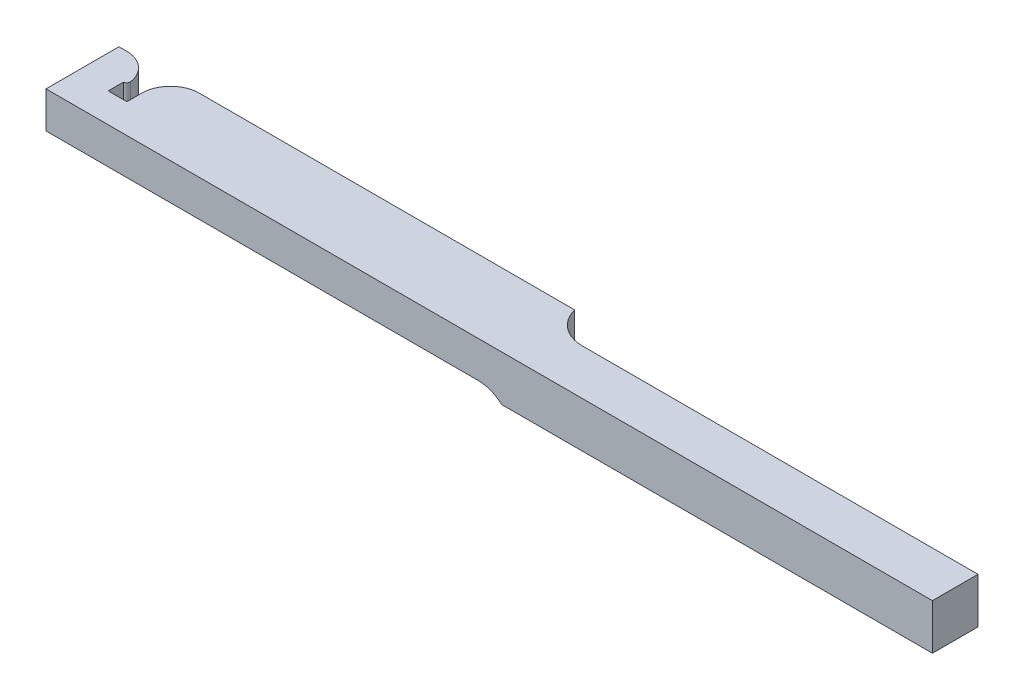
ISO-10303-21;
HEADER;
FILE_DESCRIPTION(('STEP AP214'),'2;1');
FILE_NAME('part.step','',(''),(''),'','','');
FILE_SCHEMA(('AUTOMOTIVE_DESIGN { 1 0 10303 214 1 1 1 1 }'));
ENDSEC;
DATA;
#1=APPLICATION_CONTEXT('core data for automotive mechanical design processes');
#2=APPLICATION_PROTOCOL_DEFINITION('international standard','automotive_design',2000,#1);
#3=PRODUCT_CONTEXT('',#1,'mechanical');
#4=PRODUCT('Part','Part','',(#3));
#5=PRODUCT_RELATED_PRODUCT_CATEGORY('part','',(#4));
#6=PRODUCT_DEFINITION_FORMATION('','',#4);
#7=PRODUCT_DEFINITION_CONTEXT('part definition',#1,'design');
#8=PRODUCT_DEFINITION('design','',#6,#7);
#9=PRODUCT_DEFINITION_SHAPE('','',#8);
#10=(LENGTH_UNIT() NAMED_UNIT(*) SI_UNIT(.MILLI.,.METRE.));
#11=(NAMED_UNIT(*) PLANE_ANGLE_UNIT() SI_UNIT($,.RADIAN.));
#12=(NAMED_UNIT(*) SI_UNIT($,.STERADIAN.) SOLID_ANGLE_UNIT());
#13=UNCERTAINTY_MEASURE_WITH_UNIT(LENGTH_MEASURE(1.E-05),#10,'distance_accuracy_value','');
#14=(GEOMETRIC_REPRESENTATION_CONTEXT(3) GLOBAL_UNCERTAINTY_ASSIGNED_CONTEXT((#13)) GLOBAL_UNIT_ASSIGNED_CONTEXT((#10,
#11,#12)) REPRESENTATION_CONTEXT('',''));
#15=CARTESIAN_POINT('',(0.,0.,0.));
#16=DIRECTION('',(0.,0.,1.));
#17=DIRECTION('',(1.,0.,0.));
#18=AXIS2_PLACEMENT_3D('',#15,#16,#17);
#19=CARTESIAN_POINT('',(63.5,0.,-10.16));
#20=DIRECTION('',(0.,0.,1.));
#21=DIRECTION('',(1.,0.,0.));
#22=AXIS2_PLACEMENT_3D('',#19,#20,#21);
#23=PLANE('',#22);
#24=DIRECTION('',(-1.,0.,0.));
#25=VECTOR('',#24,1.);
#26=CARTESIAN_POINT('',(63.5,-5.08,-10.16));
#27=LINE('',#26,#25);
#28=CARTESIAN_POINT('',(1.08014637540482,-5.08,-10.16));
#29=VERTEX_POINT('',#28);
#30=CARTESIAN_POINT('',(0.,-5.08,-10.16));
#31=VERTEX_POINT('',#30);
#32=EDGE_CURVE('E217',#29,#31,#27,.T.);
#33=ORIENTED_EDGE('',*,*,#32,.T.);
#34=DIRECTION('',(0.,-1.,0.));
#35=VECTOR('',#34,1.);
#36=CARTESIAN_POINT('',(0.,0.,-10.16));
#37=LINE('',#36,#35);
#38=CARTESIAN_POINT('',(0.,0.,-10.16));
#39=VERTEX_POINT('',#38);
#40=EDGE_CURVE('E211',#39,#31,#37,.T.);
#41=ORIENTED_EDGE('',*,*,#40,.F.);
#42=DIRECTION('',(-1.,0.,0.));
#43=VECTOR('',#42,1.);
#44=CARTESIAN_POINT('',(63.5,0.,-10.16));
#45=LINE('',#44,#43);
#46=CARTESIAN_POINT('',(1.08014637540482,0.,-10.16));
#47=VERTEX_POINT('',#46);
#48=EDGE_CURVE('E221',#47,#39,#45,.T.);
#49=ORIENTED_EDGE('',*,*,#48,.F.);
#50=DIRECTION('',(0.,1.,0.));
#51=VECTOR('',#50,1.);
#52=CARTESIAN_POINT('',(1.08014637540482,0.,-10.16));
#53=LINE('',#52,#51);
#54=EDGE_CURVE('E239',#29,#47,#53,.T.);
#55=ORIENTED_EDGE('',*,*,#54,.F.);
#56=EDGE_LOOP('',(#33,#41,#49,#55));
#57=FACE_BOUND('',#56,.T.);
#58=ADVANCED_FACE('F36',(#57),#23,.F.);
#59=CARTESIAN_POINT('',(63.5,0.,0.));
#60=DIRECTION('',(0.,0.,-1.));
#61=DIRECTION('',(-1.,0.,0.));
#62=AXIS2_PLACEMENT_3D('',#59,#60,#61);
#63=PLANE('',#62);
#64=DIRECTION('',(0.,1.,0.));
#65=VECTOR('',#64,1.);
#66=CARTESIAN_POINT('',(0.,0.,0.));
#67=LINE('',#66,#65);
#68=CARTESIAN_POINT('',(0.,-5.08,0.));
#69=VERTEX_POINT('',#68);
#70=CARTESIAN_POINT('',(0.,0.,0.));
#71=VERTEX_POINT('',#70);
#72=EDGE_CURVE('E203',#69,#71,#67,.T.);
#73=ORIENTED_EDGE('',*,*,#72,.F.);
#74=DIRECTION('',(-1.,0.,0.));
#75=VECTOR('',#74,1.);
#76=CARTESIAN_POINT('',(63.5,-5.08,0.));
#77=LINE('',#76,#75);
#78=CARTESIAN_POINT('',(60.170270281239,-5.08,0.));
#79=VERTEX_POINT('',#78);
#80=EDGE_CURVE('E207',#79,#69,#77,.T.);
#81=ORIENTED_EDGE('',*,*,#80,.F.);
#82=CARTESIAN_POINT('',(60.170270281239,-10.08,0.));
#83=DIRECTION('',(0.,0.,1.));
#84=DIRECTION('',(-1.,0.,0.));
#85=AXIS2_PLACEMENT_3D('',#82,#83,#84);
#86=CIRCLE('',#85,5.);
#87=CARTESIAN_POINT('',(63.5,-6.35,0.));
#88=VERTEX_POINT('',#87);
#89=EDGE_CURVE('E255',#88,#79,#86,.T.);
#90=ORIENTED_EDGE('',*,*,#89,.F.);
#91=DIRECTION('',(-1.,0.,0.));
#92=VECTOR('',#91,1.);
#93=CARTESIAN_POINT('',(123.5,-6.35,0.));
#94=LINE('',#93,#92);
#95=CARTESIAN_POINT('',(123.5,-6.35,0.));
#96=VERTEX_POINT('',#95);
#97=EDGE_CURVE('E165',#96,#88,#94,.T.);
#98=ORIENTED_EDGE('',*,*,#97,.F.);
#99=DIRECTION('',(0.,1.,0.));
#100=VECTOR('',#99,1.);
#101=CARTESIAN_POINT('',(123.5,0.,0.));
#102=LINE('',#101,#100);
#103=CARTESIAN_POINT('',(123.5,0.,0.));
#104=VERTEX_POINT('',#103);
#105=EDGE_CURVE('E144',#96,#104,#102,.T.);
#106=ORIENTED_EDGE('',*,*,#105,.T.);
#107=DIRECTION('',(-1.,0.,0.));
#108=VECTOR('',#107,1.);
#109=CARTESIAN_POINT('',(63.5,0.,0.));
#110=LINE('',#109,#108);
#111=EDGE_CURVE('E152',#104,#71,#110,.T.);
#112=ORIENTED_EDGE('',*,*,#111,.T.);
#113=EDGE_LOOP('',(#73,#81,#90,#98,#106,#112));
#114=FACE_BOUND('',#113,.T.);
#115=ADVANCED_FACE('F162',(#114),#63,.F.);
#116=CARTESIAN_POINT('',(63.5,0.,0.));
#117=DIRECTION('',(0.,-1.,0.));
#118=DIRECTION('',(0.,0.,1.));
#119=AXIS2_PLACEMENT_3D('',#116,#117,#118);
#120=PLANE('',#119);
#121=CARTESIAN_POINT('',(1.08014637540482,0.,-6.16));
#122=DIRECTION('',(0.,1.,0.));
#123=DIRECTION('',(0.,0.,1.));
#124=AXIS2_PLACEMENT_3D('',#121,#122,#123);
#125=CIRCLE('',#124,4.);
#126=CARTESIAN_POINT('',(5.03356850561445,0.,-6.76864888102149));
#127=VERTEX_POINT('',#126);
#128=EDGE_CURVE('E233',#47,#127,#125,.F.);
#129=ORIENTED_EDGE('',*,*,#128,.F.);
#130=ORIENTED_EDGE('',*,*,#48,.T.);
#131=DIRECTION('',(0.,0.,-1.));
#132=VECTOR('',#131,1.);
#133=CARTESIAN_POINT('',(0.,0.,0.));
#134=LINE('',#133,#132);
#135=EDGE_CURVE('E155',#71,#39,#134,.T.);
#136=ORIENTED_EDGE('',*,*,#135,.F.);
#137=ORIENTED_EDGE('',*,*,#111,.F.);
#138=DIRECTION('',(0.,0.,-1.));
#139=VECTOR('',#138,1.);
#140=CARTESIAN_POINT('',(123.5,0.,0.));
#141=LINE('',#140,#139);
#142=CARTESIAN_POINT('',(123.5,0.,-6.35));
#143=VERTEX_POINT('',#142);
#144=EDGE_CURVE('E140',#104,#143,#141,.T.);
#145=ORIENTED_EDGE('',*,*,#144,.T.);
#146=DIRECTION('',(-1.,0.,0.));
#147=VECTOR('',#146,1.);
#148=CARTESIAN_POINT('',(123.5,0.,-6.35));
#149=LINE('',#148,#147);
#150=CARTESIAN_POINT('',(68.3563257716096,0.,-6.35));
#151=VERTEX_POINT('',#150);
#152=EDGE_CURVE('E177',#143,#151,#149,.T.);
#153=ORIENTED_EDGE('',*,*,#152,.T.);
#154=CARTESIAN_POINT('',(68.3563257716096,0.,-11.35));
#155=DIRECTION('',(0.,1.,0.));
#156=DIRECTION('',(0.,0.,1.));
#157=AXIS2_PLACEMENT_3D('',#154,#155,#156);
#158=CIRCLE('',#157,5.);
#159=CARTESIAN_POINT('',(63.5,0.,-10.16));
#160=VERTEX_POINT('',#159);
#161=EDGE_CURVE('E11',#160,#151,#158,.T.);
#162=ORIENTED_EDGE('',*,*,#161,.F.);
#163=CARTESIAN_POINT('',(11.1882,0.,-10.16));
#164=VERTEX_POINT('',#163);
#165=EDGE_CURVE('E160',#160,#164,#45,.T.);
#166=ORIENTED_EDGE('',*,*,#165,.T.);
#167=CARTESIAN_POINT('',(11.1882,0.,-6.16));
#168=DIRECTION('',(0.,1.,0.));
#169=DIRECTION('',(0.,0.,1.));
#170=AXIS2_PLACEMENT_3D('',#167,#168,#169);
#171=CIRCLE('',#170,4.);
#172=CARTESIAN_POINT('',(7.18820000000001,0.,-6.16));
#173=VERTEX_POINT('',#172);
#174=EDGE_CURVE('E236',#173,#164,#171,.F.);
#175=ORIENTED_EDGE('',*,*,#174,.F.);
#176=DIRECTION('',(0.,0.,-1.));
#177=VECTOR('',#176,1.);
#178=CARTESIAN_POINT('',(7.18820000000001,0.,0.));
#179=LINE('',#178,#177);
#180=CARTESIAN_POINT('',(7.1882,0.,-4.08601961152276));
#181=VERTEX_POINT('',#180);
#182=EDGE_CURVE('E200',#181,#173,#179,.T.);
#183=ORIENTED_EDGE('',*,*,#182,.F.);
#184=DIRECTION('',(1.,0.,0.));
#185=VECTOR('',#184,1.);
#186=CARTESIAN_POINT('',(63.5,0.,-4.08601961152276));
#187=LINE('',#186,#185);
#188=CARTESIAN_POINT('',(4.58,0.,-4.08601961152276));
#189=VERTEX_POINT('',#188);
#190=EDGE_CURVE('E197',#189,#181,#187,.T.);
#191=ORIENTED_EDGE('',*,*,#190,.F.);
#192=DIRECTION('',(0.,0.,1.));
#193=VECTOR('',#192,1.);
#194=CARTESIAN_POINT('',(4.58,0.,0.));
#195=LINE('',#194,#193);
#196=CARTESIAN_POINT('',(4.58,0.,-6.19421961152276));
#197=VERTEX_POINT('',#196);
#198=EDGE_CURVE('E185',#197,#189,#195,.T.);
#199=ORIENTED_EDGE('',*,*,#198,.F.);
#200=CARTESIAN_POINT('',(4.53939073933825,0.,-6.6925677708938));
#201=DIRECTION('',(0.,1.,0.));
#202=DIRECTION('',(0.,0.,1.));
#203=AXIS2_PLACEMENT_3D('',#200,#201,#202);
#204=CIRCLE('',#203,0.5);
#205=EDGE_CURVE('E247',#127,#197,#204,.F.);
#206=ORIENTED_EDGE('',*,*,#205,.F.);
#207=EDGE_LOOP('',(#129,#130,#136,#137,#145,#153,#162,#166,#175,#183,#191,#199,#206));
#208=FACE_BOUND('',#207,.T.);
#209=ADVANCED_FACE('F153',(#208),#120,.F.);
#210=ORIENTED_EDGE('',*,*,#165,.F.);
#211=DIRECTION('',(0.,-1.,0.));
#212=VECTOR('',#211,1.);
#213=CARTESIAN_POINT('',(63.5,0.,-10.16));
#214=LINE('',#213,#212);
#215=CARTESIAN_POINT('',(63.5,-5.08,-10.16));
#216=VERTEX_POINT('',#215);
#217=EDGE_CURVE('E204',#160,#216,#214,.T.);
#218=ORIENTED_EDGE('',*,*,#217,.T.);
#219=CARTESIAN_POINT('',(11.1882,-5.08,-10.16));
#220=VERTEX_POINT('',#219);
#221=EDGE_CURVE('E218',#216,#220,#27,.T.);
#222=ORIENTED_EDGE('',*,*,#221,.T.);
#223=DIRECTION('',(0.,-1.,0.));
#224=VECTOR('',#223,1.);
#225=CARTESIAN_POINT('',(11.1882,0.,-10.16));
#226=LINE('',#225,#224);
#227=EDGE_CURVE('E159',#164,#220,#226,.T.);
#228=ORIENTED_EDGE('',*,*,#227,.F.);
#229=EDGE_LOOP('',(#210,#218,#222,#228));
#230=FACE_BOUND('',#229,.T.);
#231=ADVANCED_FACE('F268',(#230),#23,.F.);
#232=CARTESIAN_POINT('',(63.5,-5.08,0.));
#233=DIRECTION('',(0.,1.,0.));
#234=DIRECTION('',(0.,0.,-1.));
#235=AXIS2_PLACEMENT_3D('',#232,#233,#234);
#236=PLANE('',#235);
#237=ORIENTED_EDGE('',*,*,#80,.T.);
#238=DIRECTION('',(0.,0.,1.));
#239=VECTOR('',#238,1.);
#240=CARTESIAN_POINT('',(0.,-5.08,0.));
#241=LINE('',#240,#239);
#242=EDGE_CURVE('E208',#31,#69,#241,.T.);
#243=ORIENTED_EDGE('',*,*,#242,.F.);
#244=ORIENTED_EDGE('',*,*,#32,.F.);
#245=CARTESIAN_POINT('',(1.08014637540482,-5.08,-6.16));
#246=DIRECTION('',(0.,-1.,0.));
#247=DIRECTION('',(0.,0.,-1.));
#248=AXIS2_PLACEMENT_3D('',#245,#246,#247);
#249=CIRCLE('',#248,4.);
#250=CARTESIAN_POINT('',(5.03356850561445,-5.08,-6.76864888102149));
#251=VERTEX_POINT('',#250);
#252=EDGE_CURVE('E226',#251,#29,#249,.F.);
#253=ORIENTED_EDGE('',*,*,#252,.F.);
#254=CARTESIAN_POINT('',(4.53939073933825,-5.08,-6.6925677708938));
#255=DIRECTION('',(0.,-1.,0.));
#256=DIRECTION('',(0.,0.,-1.));
#257=AXIS2_PLACEMENT_3D('',#254,#255,#256);
#258=CIRCLE('',#257,0.5);
#259=CARTESIAN_POINT('',(4.58,-5.08,-6.19421961152276));
#260=VERTEX_POINT('',#259);
#261=EDGE_CURVE('E242',#260,#251,#258,.F.);
#262=ORIENTED_EDGE('',*,*,#261,.F.);
#263=DIRECTION('',(0.,0.,1.));
#264=VECTOR('',#263,1.);
#265=CARTESIAN_POINT('',(4.58,-5.08,-4.08601961152276));
#266=LINE('',#265,#264);
#267=CARTESIAN_POINT('',(4.58,-5.08,-4.08601961152276));
#268=VERTEX_POINT('',#267);
#269=EDGE_CURVE('E179',#260,#268,#266,.T.);
#270=ORIENTED_EDGE('',*,*,#269,.T.);
#271=DIRECTION('',(1.,0.,0.));
#272=VECTOR('',#271,1.);
#273=CARTESIAN_POINT('',(5.08,-5.08,-4.08601961152276));
#274=LINE('',#273,#272);
#275=CARTESIAN_POINT('',(7.1882,-5.08,-4.08601961152276));
#276=VERTEX_POINT('',#275);
#277=EDGE_CURVE('E189',#268,#276,#274,.T.);
#278=ORIENTED_EDGE('',*,*,#277,.T.);
#279=DIRECTION('',(0.,0.,-1.));
#280=VECTOR('',#279,1.);
#281=CARTESIAN_POINT('',(7.1882,-5.08,-10.16));
#282=LINE('',#281,#280);
#283=CARTESIAN_POINT('',(7.1882,-5.08,-6.16));
#284=VERTEX_POINT('',#283);
#285=EDGE_CURVE('E192',#276,#284,#282,.T.);
#286=ORIENTED_EDGE('',*,*,#285,.T.);
#287=CARTESIAN_POINT('',(11.1882,-5.08,-6.16));
#288=DIRECTION('',(0.,-1.,0.));
#289=DIRECTION('',(0.,0.,-1.));
#290=AXIS2_PLACEMENT_3D('',#287,#288,#289);
#291=CIRCLE('',#290,4.);
#292=EDGE_CURVE('E228',#220,#284,#291,.F.);
#293=ORIENTED_EDGE('',*,*,#292,.F.);
#294=ORIENTED_EDGE('',*,*,#221,.F.);
#295=CARTESIAN_POINT('',(68.3563257716096,-5.08,-11.35));
#296=DIRECTION('',(0.,-1.,0.));
#297=DIRECTION('',(0.,0.,-1.));
#298=AXIS2_PLACEMENT_3D('',#295,#296,#297);
#299=CIRCLE('',#298,5.);
#300=CARTESIAN_POINT('',(68.3563257716096,-5.08,-6.35));
#301=VERTEX_POINT('',#300);
#302=EDGE_CURVE('E44',#301,#216,#299,.T.);
#303=ORIENTED_EDGE('',*,*,#302,.F.);
#304=DIRECTION('',(1.,0.,0.));
#305=VECTOR('',#304,1.);
#306=CARTESIAN_POINT('',(123.5,-5.08,-6.35));
#307=LINE('',#306,#305);
#308=CARTESIAN_POINT('',(60.170270281239,-5.08,-6.35));
#309=VERTEX_POINT('',#308);
#310=EDGE_CURVE('E250',#309,#301,#307,.T.);
#311=ORIENTED_EDGE('',*,*,#310,.F.);
#312=DIRECTION('',(0.,0.,1.));
#313=VECTOR('',#312,1.);
#314=CARTESIAN_POINT('',(60.170270281239,-5.08,0.));
#315=LINE('',#314,#313);
#316=EDGE_CURVE('E252',#79,#309,#315,.F.);
#317=ORIENTED_EDGE('',*,*,#316,.F.);
#318=EDGE_LOOP('',(#237,#243,#244,#253,#262,#270,#278,#286,#293,#294,#303,#311,#317));
#319=FACE_BOUND('',#318,.T.);
#320=ADVANCED_FACE('F266',(#319),#236,.F.);
#321=CARTESIAN_POINT('',(0.,0.,0.));
#322=DIRECTION('',(-1.,0.,0.));
#323=DIRECTION('',(0.,0.,1.));
#324=AXIS2_PLACEMENT_3D('',#321,#322,#323);
#325=PLANE('',#324);
#326=ORIENTED_EDGE('',*,*,#72,.T.);
#327=ORIENTED_EDGE('',*,*,#135,.T.);
#328=ORIENTED_EDGE('',*,*,#40,.T.);
#329=ORIENTED_EDGE('',*,*,#242,.T.);
#330=EDGE_LOOP('',(#326,#327,#328,#329));
#331=FACE_BOUND('',#330,.T.);
#332=ADVANCED_FACE('F280',(#331),#325,.T.);
#333=CARTESIAN_POINT('',(7.1882,0.920000000000062,-10.16));
#334=DIRECTION('',(1.,0.,0.));
#335=DIRECTION('',(0.,0.,-1.));
#336=AXIS2_PLACEMENT_3D('',#333,#334,#335);
#337=PLANE('',#336);
#338=ORIENTED_EDGE('',*,*,#285,.F.);
#339=DIRECTION('',(0.,-1.,0.));
#340=VECTOR('',#339,1.);
#341=CARTESIAN_POINT('',(7.1882,0.920000000000062,-4.08601961152276));
#342=LINE('',#341,#340);
#343=EDGE_CURVE('E195',#181,#276,#342,.T.);
#344=ORIENTED_EDGE('',*,*,#343,.F.);
#345=ORIENTED_EDGE('',*,*,#182,.T.);
#346=DIRECTION('',(0.,-1.,0.));
#347=VECTOR('',#346,1.);
#348=CARTESIAN_POINT('',(7.1882,0.920000000000062,-6.16));
#349=LINE('',#348,#347);
#350=EDGE_CURVE('E231',#284,#173,#349,.F.);
#351=ORIENTED_EDGE('',*,*,#350,.F.);
#352=EDGE_LOOP('',(#338,#344,#345,#351));
#353=FACE_BOUND('',#352,.T.);
#354=ADVANCED_FACE('F304',(#353),#337,.F.);
#355=CARTESIAN_POINT('',(5.08,0.920000000000062,-4.08601961152276));
#356=DIRECTION('',(0.,0.,1.));
#357=DIRECTION('',(1.,0.,0.));
#358=AXIS2_PLACEMENT_3D('',#355,#356,#357);
#359=PLANE('',#358);
#360=ORIENTED_EDGE('',*,*,#190,.T.);
#361=ORIENTED_EDGE('',*,*,#343,.T.);
#362=ORIENTED_EDGE('',*,*,#277,.F.);
#363=DIRECTION('',(0.,-1.,0.));
#364=VECTOR('',#363,1.);
#365=CARTESIAN_POINT('',(4.58,0.920000000000062,-4.08601961152276));
#366=LINE('',#365,#364);
#367=EDGE_CURVE('E183',#189,#268,#366,.T.);
#368=ORIENTED_EDGE('',*,*,#367,.F.);
#369=EDGE_LOOP('',(#360,#361,#362,#368));
#370=FACE_BOUND('',#369,.T.);
#371=ADVANCED_FACE('F300',(#370),#359,.F.);
#372=CARTESIAN_POINT('',(4.58,0.920000000000062,-4.08601961152276));
#373=DIRECTION('',(-1.,0.,0.));
#374=DIRECTION('',(0.,0.,1.));
#375=AXIS2_PLACEMENT_3D('',#372,#373,#374);
#376=PLANE('',#375);
#377=DIRECTION('',(0.,-1.,0.));
#378=VECTOR('',#377,1.);
#379=CARTESIAN_POINT('',(4.58,0.920000000000062,-6.19421961152276));
#380=LINE('',#379,#378);
#381=EDGE_CURVE('E182',#197,#260,#380,.T.);
#382=ORIENTED_EDGE('',*,*,#381,.F.);
#383=ORIENTED_EDGE('',*,*,#198,.T.);
#384=ORIENTED_EDGE('',*,*,#367,.T.);
#385=ORIENTED_EDGE('',*,*,#269,.F.);
#386=EDGE_LOOP('',(#382,#383,#384,#385));
#387=FACE_BOUND('',#386,.T.);
#388=ADVANCED_FACE('F296',(#387),#376,.F.);
#389=CARTESIAN_POINT('',(123.5,0.,-6.35));
#390=DIRECTION('',(0.,0.,1.));
#391=DIRECTION('',(0.,1.,0.));
#392=AXIS2_PLACEMENT_3D('',#389,#390,#391);
#393=PLANE('',#392);
#394=ORIENTED_EDGE('',*,*,#152,.F.);
#395=DIRECTION('',(0.,-1.,0.));
#396=VECTOR('',#395,1.);
#397=CARTESIAN_POINT('',(123.5,0.,-6.35));
#398=LINE('',#397,#396);
#399=CARTESIAN_POINT('',(123.5,-6.35,-6.35));
#400=VERTEX_POINT('',#399);
#401=EDGE_CURVE('E147',#143,#400,#398,.T.);
#402=ORIENTED_EDGE('',*,*,#401,.T.);
#403=DIRECTION('',(-1.,0.,0.));
#404=VECTOR('',#403,1.);
#405=CARTESIAN_POINT('',(123.5,-6.35,-6.35));
#406=LINE('',#405,#404);
#407=CARTESIAN_POINT('',(63.5,-6.35,-6.35));
#408=VERTEX_POINT('',#407);
#409=EDGE_CURVE('E174',#400,#408,#406,.T.);
#410=ORIENTED_EDGE('',*,*,#409,.T.);
#411=CARTESIAN_POINT('',(60.170270281239,-10.08,-6.35));
#412=DIRECTION('',(0.,0.,-1.));
#413=DIRECTION('',(0.,1.,0.));
#414=AXIS2_PLACEMENT_3D('',#411,#412,#413);
#415=CIRCLE('',#414,5.);
#416=EDGE_CURVE('E258',#309,#408,#415,.T.);
#417=ORIENTED_EDGE('',*,*,#416,.F.);
#418=ORIENTED_EDGE('',*,*,#310,.T.);
#419=DIRECTION('',(0.,-1.,0.));
#420=VECTOR('',#419,1.);
#421=CARTESIAN_POINT('',(68.3563257716096,0.,-6.35));
#422=LINE('',#421,#420);
#423=EDGE_CURVE('E50',#151,#301,#422,.T.);
#424=ORIENTED_EDGE('',*,*,#423,.F.);
#425=EDGE_LOOP('',(#394,#402,#410,#417,#418,#424));
#426=FACE_BOUND('',#425,.T.);
#427=ADVANCED_FACE('F271',(#426),#393,.F.);
#428=CARTESIAN_POINT('',(123.5,-6.35,0.));
#429=DIRECTION('',(0.,1.,0.));
#430=DIRECTION('',(0.,0.,-1.));
#431=AXIS2_PLACEMENT_3D('',#428,#429,#430);
#432=PLANE('',#431);
#433=DIRECTION('',(0.,0.,1.));
#434=VECTOR('',#433,1.);
#435=CARTESIAN_POINT('',(63.5,-6.35,0.));
#436=LINE('',#435,#434);
#437=EDGE_CURVE('E166',#408,#88,#436,.T.);
#438=ORIENTED_EDGE('',*,*,#437,.F.);
#439=ORIENTED_EDGE('',*,*,#409,.F.);
#440=DIRECTION('',(0.,0.,1.));
#441=VECTOR('',#440,1.);
#442=CARTESIAN_POINT('',(123.5,-6.35,0.));
#443=LINE('',#442,#441);
#444=EDGE_CURVE('E171',#400,#96,#443,.T.);
#445=ORIENTED_EDGE('',*,*,#444,.T.);
#446=ORIENTED_EDGE('',*,*,#97,.T.);
#447=EDGE_LOOP('',(#438,#439,#445,#446));
#448=FACE_BOUND('',#447,.T.);
#449=ADVANCED_FACE('F274',(#448),#432,.F.);
#450=CARTESIAN_POINT('',(123.5,0.,0.));
#451=DIRECTION('',(-1.,0.,0.));
#452=DIRECTION('',(0.,0.,1.));
#453=AXIS2_PLACEMENT_3D('',#450,#451,#452);
#454=PLANE('',#453);
#455=ORIENTED_EDGE('',*,*,#105,.F.);
#456=ORIENTED_EDGE('',*,*,#444,.F.);
#457=ORIENTED_EDGE('',*,*,#401,.F.);
#458=ORIENTED_EDGE('',*,*,#144,.F.);
#459=EDGE_LOOP('',(#455,#456,#457,#458));
#460=FACE_BOUND('',#459,.T.);
#461=ADVANCED_FACE('F142',(#460),#454,.F.);
#462=CARTESIAN_POINT('',(11.1882,0.,-6.16));
#463=DIRECTION('',(0.,-1.,0.));
#464=DIRECTION('',(0.,0.,1.));
#465=AXIS2_PLACEMENT_3D('',#462,#463,#464);
#466=CYLINDRICAL_SURFACE('',#465,4.);
#467=ORIENTED_EDGE('',*,*,#174,.T.);
#468=ORIENTED_EDGE('',*,*,#227,.T.);
#469=ORIENTED_EDGE('',*,*,#292,.T.);
#470=ORIENTED_EDGE('',*,*,#350,.T.);
#471=EDGE_LOOP('',(#467,#468,#469,#470));
#472=FACE_BOUND('',#471,.T.);
#473=ADVANCED_FACE('F306',(#472),#466,.T.);
#474=CARTESIAN_POINT('',(1.08014637540482,0.920000000000062,-6.16));
#475=DIRECTION('',(0.,1.,0.));
#476=DIRECTION('',(0.,0.,-1.));
#477=AXIS2_PLACEMENT_3D('',#474,#475,#476);
#478=CYLINDRICAL_SURFACE('',#477,4.);
#479=ORIENTED_EDGE('',*,*,#252,.T.);
#480=ORIENTED_EDGE('',*,*,#54,.T.);
#481=ORIENTED_EDGE('',*,*,#128,.T.);
#482=DIRECTION('',(0.,1.,0.));
#483=VECTOR('',#482,1.);
#484=CARTESIAN_POINT('',(5.03356850561445,0.920000000000062,-6.76864888102149));
#485=LINE('',#484,#483);
#486=EDGE_CURVE('E245',#251,#127,#485,.T.);
#487=ORIENTED_EDGE('',*,*,#486,.F.);
#488=EDGE_LOOP('',(#479,#480,#481,#487));
#489=FACE_BOUND('',#488,.T.);
#490=ADVANCED_FACE('F289',(#489),#478,.T.);
#491=CARTESIAN_POINT('',(4.53939073933825,0.920000000000062,-6.6925677708938));
#492=DIRECTION('',(0.,1.,0.));
#493=DIRECTION('',(0.,0.,-1.));
#494=AXIS2_PLACEMENT_3D('',#491,#492,#493);
#495=CYLINDRICAL_SURFACE('',#494,0.5);
#496=ORIENTED_EDGE('',*,*,#205,.T.);
#497=ORIENTED_EDGE('',*,*,#381,.T.);
#498=ORIENTED_EDGE('',*,*,#261,.T.);
#499=ORIENTED_EDGE('',*,*,#486,.T.);
#500=EDGE_LOOP('',(#496,#497,#498,#499));
#501=FACE_BOUND('',#500,.T.);
#502=ADVANCED_FACE('F292',(#501),#495,.T.);
#503=CARTESIAN_POINT('',(60.170270281239,-10.08,0.));
#504=DIRECTION('',(0.,0.,1.));
#505=DIRECTION('',(1.,0.,0.));
#506=AXIS2_PLACEMENT_3D('',#503,#504,#505);
#507=CYLINDRICAL_SURFACE('',#506,5.);
#508=ORIENTED_EDGE('',*,*,#416,.T.);
#509=ORIENTED_EDGE('',*,*,#437,.T.);
#510=ORIENTED_EDGE('',*,*,#89,.T.);
#511=ORIENTED_EDGE('',*,*,#316,.T.);
#512=EDGE_LOOP('',(#508,#509,#510,#511));
#513=FACE_BOUND('',#512,.T.);
#514=ADVANCED_FACE('F276',(#513),#507,.F.);
#515=CARTESIAN_POINT('',(68.3563257716096,0.,-11.35));
#516=DIRECTION('',(0.,-1.,0.));
#517=DIRECTION('',(0.,0.,1.));
#518=AXIS2_PLACEMENT_3D('',#515,#516,#517);
#519=CYLINDRICAL_SURFACE('',#518,5.);
#520=ORIENTED_EDGE('',*,*,#161,.T.);
#521=ORIENTED_EDGE('',*,*,#423,.T.);
#522=ORIENTED_EDGE('',*,*,#302,.T.);
#523=ORIENTED_EDGE('',*,*,#217,.F.);
#524=EDGE_LOOP('',(#520,#521,#522,#523));
#525=FACE_BOUND('',#524,.T.);
#526=ADVANCED_FACE('F38',(#525),#519,.F.);
#527=CLOSED_SHELL('',(#58,#115,#209,#231,#320,#332,#354,#371,#388,#427,#449,#461,#473,#490,#502,
#514,#526));
#528=MANIFOLD_SOLID_BREP('B2',#527);
#529=ADVANCED_BREP_SHAPE_REPRESENTATION('',(#18,#528),#14);
#530=SHAPE_DEFINITION_REPRESENTATION(#9,#529);
ENDSEC;
END-ISO-10303-21;
